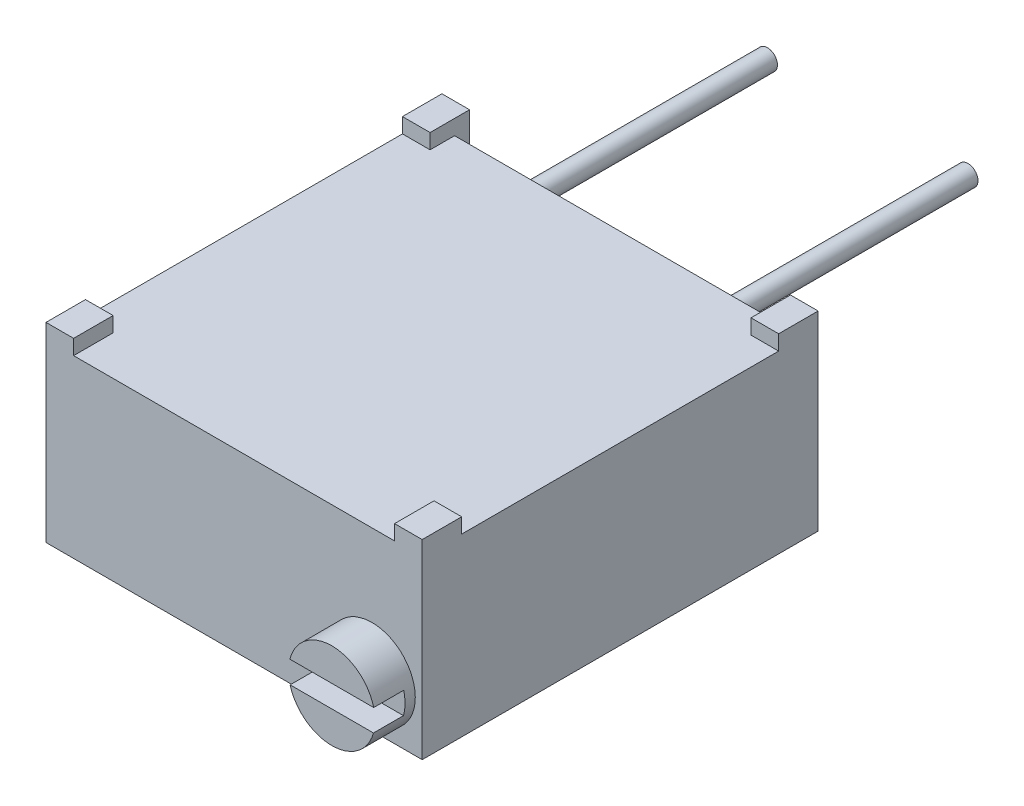
ISO-10303-21;
HEADER;
FILE_DESCRIPTION(('STEP AP214'),'2;1');
FILE_NAME('part.step','',(''),(''),'','','');
FILE_SCHEMA(('AUTOMOTIVE_DESIGN { 1 0 10303 214 1 1 1 1 }'));
ENDSEC;
DATA;
#1=APPLICATION_CONTEXT('core data for automotive mechanical design processes');
#2=APPLICATION_PROTOCOL_DEFINITION('international standard','automotive_design',2000,#1);
#3=PRODUCT_CONTEXT('',#1,'mechanical');
#4=PRODUCT('Part','Part','',(#3));
#5=PRODUCT_RELATED_PRODUCT_CATEGORY('part','',(#4));
#6=PRODUCT_DEFINITION_FORMATION('','',#4);
#7=PRODUCT_DEFINITION_CONTEXT('part definition',#1,'design');
#8=PRODUCT_DEFINITION('design','',#6,#7);
#9=PRODUCT_DEFINITION_SHAPE('','',#8);
#10=(LENGTH_UNIT() NAMED_UNIT(*) SI_UNIT(.MILLI.,.METRE.));
#11=(NAMED_UNIT(*) PLANE_ANGLE_UNIT() SI_UNIT($,.RADIAN.));
#12=(NAMED_UNIT(*) SI_UNIT($,.STERADIAN.) SOLID_ANGLE_UNIT());
#13=UNCERTAINTY_MEASURE_WITH_UNIT(LENGTH_MEASURE(1.E-05),#10,'distance_accuracy_value','');
#14=(GEOMETRIC_REPRESENTATION_CONTEXT(3) GLOBAL_UNCERTAINTY_ASSIGNED_CONTEXT((#13)) GLOBAL_UNIT_ASSIGNED_CONTEXT((#10,
#11,#12)) REPRESENTATION_CONTEXT('',''));
#15=CARTESIAN_POINT('',(0.,0.,0.));
#16=DIRECTION('',(0.,0.,1.));
#17=DIRECTION('',(1.,0.,0.));
#18=AXIS2_PLACEMENT_3D('',#15,#16,#17);
#19=CARTESIAN_POINT('',(0.,0.,-6.02));
#20=DIRECTION('',(0.,0.,1.));
#21=DIRECTION('',(1.,0.,0.));
#22=AXIS2_PLACEMENT_3D('',#19,#20,#21);
#23=PLANE('',#22);
#24=CARTESIAN_POINT('',(0.,0.,-6.02));
#25=DIRECTION('',(0.,0.,1.));
#26=DIRECTION('',(1.,0.,0.));
#27=AXIS2_PLACEMENT_3D('',#24,#25,#26);
#28=CIRCLE('',#27,0.255);
#29=CARTESIAN_POINT('',(0.255,0.,-6.02));
#30=VERTEX_POINT('',#29);
#31=EDGE_CURVE('E41',#30,#30,#28,.T.);
#32=ORIENTED_EDGE('',*,*,#31,.F.);
#33=EDGE_LOOP('',(#32));
#34=FACE_BOUND('',#33,.T.);
#35=ADVANCED_FACE('F16',(#34),#23,.F.);
#36=CARTESIAN_POINT('',(-2.54,-2.54,-6.02));
#37=DIRECTION('',(0.,0.,1.));
#38=DIRECTION('',(1.,0.,0.));
#39=AXIS2_PLACEMENT_3D('',#36,#37,#38);
#40=PLANE('',#39);
#41=CARTESIAN_POINT('',(-2.54,-2.54,-6.02));
#42=DIRECTION('',(0.,0.,1.));
#43=DIRECTION('',(1.,0.,0.));
#44=AXIS2_PLACEMENT_3D('',#41,#42,#43);
#45=CIRCLE('',#44,0.255);
#46=CARTESIAN_POINT('',(-2.285,-2.54,-6.02));
#47=VERTEX_POINT('',#46);
#48=EDGE_CURVE('E260',#47,#47,#45,.T.);
#49=ORIENTED_EDGE('',*,*,#48,.F.);
#50=EDGE_LOOP('',(#49));
#51=FACE_BOUND('',#50,.T.);
#52=ADVANCED_FACE('F661',(#51),#40,.F.);
#53=CARTESIAN_POINT('',(-5.08,0.,-6.02));
#54=DIRECTION('',(0.,0.,1.));
#55=DIRECTION('',(1.,0.,0.));
#56=AXIS2_PLACEMENT_3D('',#53,#54,#55);
#57=PLANE('',#56);
#58=CARTESIAN_POINT('',(-5.08,0.,-6.02));
#59=DIRECTION('',(0.,0.,1.));
#60=DIRECTION('',(1.,0.,0.));
#61=AXIS2_PLACEMENT_3D('',#58,#59,#60);
#62=CIRCLE('',#61,0.255);
#63=CARTESIAN_POINT('',(-4.825,0.,-6.02));
#64=VERTEX_POINT('',#63);
#65=EDGE_CURVE('E247',#64,#64,#62,.T.);
#66=ORIENTED_EDGE('',*,*,#65,.F.);
#67=EDGE_LOOP('',(#66));
#68=FACE_BOUND('',#67,.T.);
#69=ADVANCED_FACE('F674',(#68),#57,.F.);
#70=CARTESIAN_POINT('',(0.955,-2.41,11.05));
#71=DIRECTION('',(0.,0.,1.));
#72=DIRECTION('',(1.,0.,0.));
#73=AXIS2_PLACEMENT_3D('',#70,#71,#72);
#74=PLANE('',#73);
#75=CARTESIAN_POINT('',(0.955,-2.41,11.05));
#76=DIRECTION('',(0.,0.,1.));
#77=DIRECTION('',(1.,0.,0.));
#78=AXIS2_PLACEMENT_3D('',#75,#76,#77);
#79=CIRCLE('',#78,1.095);
#80=CARTESIAN_POINT('',(-0.100900089971,-2.7,11.05));
#81=VERTEX_POINT('',#80);
#82=CARTESIAN_POINT('',(2.010900089971,-2.7,11.05));
#83=VERTEX_POINT('',#82);
#84=EDGE_CURVE('E300',#81,#83,#79,.T.);
#85=ORIENTED_EDGE('',*,*,#84,.T.);
#86=DIRECTION('',(1.,0.,0.));
#87=VECTOR('',#86,1.);
#88=CARTESIAN_POINT('',(-3.64,-2.7,11.05));
#89=LINE('',#88,#87);
#90=EDGE_CURVE('E11',#81,#83,#89,.T.);
#91=ORIENTED_EDGE('',*,*,#90,.F.);
#92=EDGE_LOOP('',(#85,#91));
#93=FACE_BOUND('',#92,.T.);
#94=ADVANCED_FACE('F469',(#93),#74,.T.);
#95=CARTESIAN_POINT('',(-3.64,-2.7,10.29));
#96=DIRECTION('',(0.,1.,0.));
#97=DIRECTION('',(1.,0.,0.));
#98=AXIS2_PLACEMENT_3D('',#95,#96,#97);
#99=PLANE('',#98);
#100=DIRECTION('',(1.,0.,0.));
#101=VECTOR('',#100,1.);
#102=CARTESIAN_POINT('',(-3.64,-2.7,10.29));
#103=LINE('',#102,#101);
#104=CARTESIAN_POINT('',(-0.100900089971,-2.7,10.29));
#105=VERTEX_POINT('',#104);
#106=CARTESIAN_POINT('',(2.010900089971,-2.7,10.29));
#107=VERTEX_POINT('',#106);
#108=EDGE_CURVE('E27',#105,#107,#103,.T.);
#109=ORIENTED_EDGE('',*,*,#108,.F.);
#110=DIRECTION('',(0.,0.,1.));
#111=VECTOR('',#110,1.);
#112=CARTESIAN_POINT('',(-0.100900089971,-2.7,10.03));
#113=LINE('',#112,#111);
#114=EDGE_CURVE('E377',#105,#81,#113,.T.);
#115=ORIENTED_EDGE('',*,*,#114,.T.);
#116=ORIENTED_EDGE('',*,*,#90,.T.);
#117=DIRECTION('',(0.,0.,1.));
#118=VECTOR('',#117,1.);
#119=CARTESIAN_POINT('',(2.010900089971,-2.7,10.03));
#120=LINE('',#119,#118);
#121=EDGE_CURVE('E296',#107,#83,#120,.T.);
#122=ORIENTED_EDGE('',*,*,#121,.F.);
#123=EDGE_LOOP('',(#109,#115,#116,#122));
#124=FACE_BOUND('',#123,.T.);
#125=ADVANCED_FACE('F475',(#124),#99,.T.);
#126=CARTESIAN_POINT('',(-3.64,-2.7,10.29));
#127=DIRECTION('',(0.,0.,1.));
#128=DIRECTION('',(1.,0.,0.));
#129=AXIS2_PLACEMENT_3D('',#126,#127,#128);
#130=PLANE('',#129);
#131=DIRECTION('',(1.,0.,0.));
#132=VECTOR('',#131,1.);
#133=CARTESIAN_POINT('',(-3.64,-2.14,10.29));
#134=LINE('',#133,#132);
#135=CARTESIAN_POINT('',(-0.106190369349,-2.14,10.29));
#136=VERTEX_POINT('',#135);
#137=CARTESIAN_POINT('',(2.016190369349,-2.14,10.29));
#138=VERTEX_POINT('',#137);
#139=EDGE_CURVE('E478',#136,#138,#134,.T.);
#140=ORIENTED_EDGE('',*,*,#139,.F.);
#141=CARTESIAN_POINT('',(0.955,-2.41,10.29));
#142=DIRECTION('',(0.,0.,1.));
#143=DIRECTION('',(1.,0.,0.));
#144=AXIS2_PLACEMENT_3D('',#141,#142,#143);
#145=CIRCLE('',#144,1.095);
#146=EDGE_CURVE('E373',#136,#105,#145,.T.);
#147=ORIENTED_EDGE('',*,*,#146,.T.);
#148=ORIENTED_EDGE('',*,*,#108,.T.);
#149=CARTESIAN_POINT('',(0.955,-2.41,10.29));
#150=DIRECTION('',(0.,0.,1.));
#151=DIRECTION('',(1.,0.,0.));
#152=AXIS2_PLACEMENT_3D('',#149,#150,#151);
#153=CIRCLE('',#152,1.095);
#154=CARTESIAN_POINT('',(2.05,-2.41,10.29));
#155=VERTEX_POINT('',#154);
#156=EDGE_CURVE('E167',#107,#155,#153,.T.);
#157=ORIENTED_EDGE('',*,*,#156,.T.);
#158=CARTESIAN_POINT('',(0.955,-2.41,10.29));
#159=DIRECTION('',(0.,0.,1.));
#160=DIRECTION('',(1.,0.,0.));
#161=AXIS2_PLACEMENT_3D('',#158,#159,#160);
#162=CIRCLE('',#161,1.095);
#163=EDGE_CURVE('E304',#155,#138,#162,.T.);
#164=ORIENTED_EDGE('',*,*,#163,.T.);
#165=EDGE_LOOP('',(#140,#147,#148,#157,#164));
#166=FACE_BOUND('',#165,.T.);
#167=ADVANCED_FACE('F18',(#166),#130,.T.);
#168=CARTESIAN_POINT('',(-3.64,-2.14,10.29));
#169=DIRECTION('',(0.,1.,0.));
#170=DIRECTION('',(1.,0.,0.));
#171=AXIS2_PLACEMENT_3D('',#168,#169,#170);
#172=PLANE('',#171);
#173=DIRECTION('',(0.,0.,1.));
#174=VECTOR('',#173,1.);
#175=CARTESIAN_POINT('',(2.016190369349,-2.14,10.03));
#176=LINE('',#175,#174);
#177=CARTESIAN_POINT('',(2.016190369349,-2.14,11.05));
#178=VERTEX_POINT('',#177);
#179=EDGE_CURVE('E301',#138,#178,#176,.T.);
#180=ORIENTED_EDGE('',*,*,#179,.T.);
#181=DIRECTION('',(1.,0.,0.));
#182=VECTOR('',#181,1.);
#183=CARTESIAN_POINT('',(-3.64,-2.14,11.05));
#184=LINE('',#183,#182);
#185=CARTESIAN_POINT('',(-0.106190369349,-2.14,11.05));
#186=VERTEX_POINT('',#185);
#187=EDGE_CURVE('E483',#186,#178,#184,.T.);
#188=ORIENTED_EDGE('',*,*,#187,.F.);
#189=DIRECTION('',(0.,0.,1.));
#190=VECTOR('',#189,1.);
#191=CARTESIAN_POINT('',(-0.106190369349,-2.14,10.03));
#192=LINE('',#191,#190);
#193=EDGE_CURVE('E376',#136,#186,#192,.T.);
#194=ORIENTED_EDGE('',*,*,#193,.F.);
#195=ORIENTED_EDGE('',*,*,#139,.T.);
#196=EDGE_LOOP('',(#180,#188,#194,#195));
#197=FACE_BOUND('',#196,.T.);
#198=ADVANCED_FACE('F485',(#197),#172,.F.);
#199=CARTESIAN_POINT('',(0.955,-2.41,11.05));
#200=DIRECTION('',(0.,0.,1.));
#201=DIRECTION('',(1.,0.,0.));
#202=AXIS2_PLACEMENT_3D('',#199,#200,#201);
#203=PLANE('',#202);
#204=ORIENTED_EDGE('',*,*,#187,.T.);
#205=CARTESIAN_POINT('',(0.955,-2.41,11.05));
#206=DIRECTION('',(0.,0.,1.));
#207=DIRECTION('',(1.,0.,0.));
#208=AXIS2_PLACEMENT_3D('',#205,#206,#207);
#209=CIRCLE('',#208,1.095);
#210=EDGE_CURVE('E305',#178,#186,#209,.T.);
#211=ORIENTED_EDGE('',*,*,#210,.T.);
#212=EDGE_LOOP('',(#204,#211));
#213=FACE_BOUND('',#212,.T.);
#214=ADVANCED_FACE('F720',(#213),#203,.T.);
#215=CARTESIAN_POINT('',(-7.305,1.14,1.));
#216=DIRECTION('',(0.,-1.,0.));
#217=DIRECTION('',(0.,0.,-1.));
#218=AXIS2_PLACEMENT_3D('',#215,#216,#217);
#219=PLANE('',#218);
#220=DIRECTION('',(0.,0.,-1.));
#221=VECTOR('',#220,1.);
#222=CARTESIAN_POINT('',(-6.605,1.14,1.));
#223=LINE('',#222,#221);
#224=CARTESIAN_POINT('',(-6.605,1.14,1.));
#225=VERTEX_POINT('',#224);
#226=CARTESIAN_POINT('',(-6.605,1.14,0.));
#227=VERTEX_POINT('',#226);
#228=EDGE_CURVE('E309',#225,#227,#223,.T.);
#229=ORIENTED_EDGE('',*,*,#228,.T.);
#230=DIRECTION('',(1.,0.,0.));
#231=VECTOR('',#230,1.);
#232=CARTESIAN_POINT('',(-7.305,1.14,0.));
#233=LINE('',#232,#231);
#234=CARTESIAN_POINT('',(-7.305,1.14,0.));
#235=VERTEX_POINT('',#234);
#236=EDGE_CURVE('E488',#235,#227,#233,.T.);
#237=ORIENTED_EDGE('',*,*,#236,.F.);
#238=DIRECTION('',(0.,0.,-1.));
#239=VECTOR('',#238,1.);
#240=CARTESIAN_POINT('',(-7.305,1.14,1.));
#241=LINE('',#240,#239);
#242=CARTESIAN_POINT('',(-7.305,1.14,1.));
#243=VERTEX_POINT('',#242);
#244=EDGE_CURVE('E441',#243,#235,#241,.T.);
#245=ORIENTED_EDGE('',*,*,#244,.F.);
#246=DIRECTION('',(1.,0.,0.));
#247=VECTOR('',#246,1.);
#248=CARTESIAN_POINT('',(-7.305,1.14,1.));
#249=LINE('',#248,#247);
#250=EDGE_CURVE('E433',#243,#225,#249,.T.);
#251=ORIENTED_EDGE('',*,*,#250,.T.);
#252=EDGE_LOOP('',(#229,#237,#245,#251));
#253=FACE_BOUND('',#252,.T.);
#254=ADVANCED_FACE('F621',(#253),#219,.F.);
#255=CARTESIAN_POINT('',(-7.305,1.14,0.));
#256=DIRECTION('',(0.,0.,-1.));
#257=DIRECTION('',(0.,-1.,0.));
#258=AXIS2_PLACEMENT_3D('',#255,#256,#257);
#259=PLANE('',#258);
#260=DIRECTION('',(0.,-1.,0.));
#261=VECTOR('',#260,1.);
#262=CARTESIAN_POINT('',(-7.305,1.14,0.));
#263=LINE('',#262,#261);
#264=CARTESIAN_POINT('',(-7.305,-3.69,0.));
#265=VERTEX_POINT('',#264);
#266=EDGE_CURVE('E396',#235,#265,#263,.T.);
#267=ORIENTED_EDGE('',*,*,#266,.F.);
#268=ORIENTED_EDGE('',*,*,#236,.T.);
#269=DIRECTION('',(0.,-1.,0.));
#270=VECTOR('',#269,1.);
#271=CARTESIAN_POINT('',(-6.605,1.14,0.));
#272=LINE('',#271,#270);
#273=CARTESIAN_POINT('',(-6.605,-3.69,0.));
#274=VERTEX_POINT('',#273);
#275=EDGE_CURVE('E306',#227,#274,#272,.T.);
#276=ORIENTED_EDGE('',*,*,#275,.T.);
#277=DIRECTION('',(1.,0.,0.));
#278=VECTOR('',#277,1.);
#279=CARTESIAN_POINT('',(-7.305,-3.69,0.));
#280=LINE('',#279,#278);
#281=EDGE_CURVE('E354',#265,#274,#280,.T.);
#282=ORIENTED_EDGE('',*,*,#281,.F.);
#283=EDGE_LOOP('',(#267,#268,#276,#282));
#284=FACE_BOUND('',#283,.T.);
#285=ADVANCED_FACE('F617',(#284),#259,.T.);
#286=CARTESIAN_POINT('',(0.,0.,-6.02));
#287=DIRECTION('',(0.,0.,1.));
#288=DIRECTION('',(1.,0.,0.));
#289=AXIS2_PLACEMENT_3D('',#286,#287,#288);
#290=CYLINDRICAL_SURFACE('',#289,0.255);
#291=CARTESIAN_POINT('',(0.,0.,0.38));
#292=DIRECTION('',(0.,0.,1.));
#293=DIRECTION('',(1.,0.,0.));
#294=AXIS2_PLACEMENT_3D('',#291,#292,#293);
#295=CIRCLE('',#294,0.255);
#296=CARTESIAN_POINT('',(0.255,0.,0.38));
#297=VERTEX_POINT('',#296);
#298=EDGE_CURVE('E310',#297,#297,#295,.T.);
#299=ORIENTED_EDGE('',*,*,#298,.F.);
#300=DIRECTION('',(0.,0.,1.));
#301=VECTOR('',#300,1.);
#302=CARTESIAN_POINT('',(0.255,0.,-6.02));
#303=LINE('',#302,#301);
#304=EDGE_CURVE('E293',#30,#297,#303,.T.);
#305=ORIENTED_EDGE('',*,*,#304,.F.);
#306=ORIENTED_EDGE('',*,*,#31,.T.);
#307=ORIENTED_EDGE('',*,*,#304,.T.);
#308=EDGE_LOOP('',(#299,#305,#306,#307));
#309=FACE_BOUND('',#308,.T.);
#310=ADVANCED_FACE('F737',(#309),#290,.T.);
#311=CARTESIAN_POINT('',(-2.54,-2.54,-6.02));
#312=DIRECTION('',(0.,0.,1.));
#313=DIRECTION('',(1.,0.,0.));
#314=AXIS2_PLACEMENT_3D('',#311,#312,#313);
#315=CYLINDRICAL_SURFACE('',#314,0.255);
#316=CARTESIAN_POINT('',(-2.54,-2.54,0.38));
#317=DIRECTION('',(0.,0.,1.));
#318=DIRECTION('',(1.,0.,0.));
#319=AXIS2_PLACEMENT_3D('',#316,#317,#318);
#320=CIRCLE('',#319,0.255);
#321=CARTESIAN_POINT('',(-2.285,-2.54,0.38));
#322=VERTEX_POINT('',#321);
#323=EDGE_CURVE('E323',#322,#322,#320,.T.);
#324=ORIENTED_EDGE('',*,*,#323,.F.);
#325=DIRECTION('',(0.,0.,1.));
#326=VECTOR('',#325,1.);
#327=CARTESIAN_POINT('',(-2.285,-2.54,-6.02));
#328=LINE('',#327,#326);
#329=EDGE_CURVE('E254',#47,#322,#328,.T.);
#330=ORIENTED_EDGE('',*,*,#329,.F.);
#331=ORIENTED_EDGE('',*,*,#48,.T.);
#332=ORIENTED_EDGE('',*,*,#329,.T.);
#333=EDGE_LOOP('',(#324,#330,#331,#332));
#334=FACE_BOUND('',#333,.T.);
#335=ADVANCED_FACE('F742',(#334),#315,.T.);
#336=CARTESIAN_POINT('',(-5.08,0.,-6.02));
#337=DIRECTION('',(0.,0.,1.));
#338=DIRECTION('',(1.,0.,0.));
#339=AXIS2_PLACEMENT_3D('',#336,#337,#338);
#340=CYLINDRICAL_SURFACE('',#339,0.255);
#341=CARTESIAN_POINT('',(-5.08,0.,0.38));
#342=DIRECTION('',(0.,0.,1.));
#343=DIRECTION('',(1.,0.,0.));
#344=AXIS2_PLACEMENT_3D('',#341,#342,#343);
#345=CIRCLE('',#344,0.255);
#346=CARTESIAN_POINT('',(-4.825,0.,0.38));
#347=VERTEX_POINT('',#346);
#348=EDGE_CURVE('E332',#347,#347,#345,.T.);
#349=ORIENTED_EDGE('',*,*,#348,.F.);
#350=DIRECTION('',(0.,0.,1.));
#351=VECTOR('',#350,1.);
#352=CARTESIAN_POINT('',(-4.825,0.,-6.02));
#353=LINE('',#352,#351);
#354=EDGE_CURVE('E250',#64,#347,#353,.T.);
#355=ORIENTED_EDGE('',*,*,#354,.F.);
#356=ORIENTED_EDGE('',*,*,#65,.T.);
#357=ORIENTED_EDGE('',*,*,#354,.T.);
#358=EDGE_LOOP('',(#349,#355,#356,#357));
#359=FACE_BOUND('',#358,.T.);
#360=ADVANCED_FACE('F249',(#359),#340,.T.);
#361=CARTESIAN_POINT('',(1.525,1.14,1.));
#362=DIRECTION('',(0.,-1.,0.));
#363=DIRECTION('',(0.,0.,-1.));
#364=AXIS2_PLACEMENT_3D('',#361,#362,#363);
#365=PLANE('',#364);
#366=DIRECTION('',(0.,0.,-1.));
#367=VECTOR('',#366,1.);
#368=CARTESIAN_POINT('',(2.225,1.14,1.));
#369=LINE('',#368,#367);
#370=CARTESIAN_POINT('',(2.225,1.14,1.));
#371=VERTEX_POINT('',#370);
#372=CARTESIAN_POINT('',(2.225,1.14,0.));
#373=VERTEX_POINT('',#372);
#374=EDGE_CURVE('E281',#371,#373,#369,.T.);
#375=ORIENTED_EDGE('',*,*,#374,.T.);
#376=DIRECTION('',(1.,0.,0.));
#377=VECTOR('',#376,1.);
#378=CARTESIAN_POINT('',(1.525,1.14,0.));
#379=LINE('',#378,#377);
#380=CARTESIAN_POINT('',(1.525,1.14,0.));
#381=VERTEX_POINT('',#380);
#382=EDGE_CURVE('E103',#381,#373,#379,.T.);
#383=ORIENTED_EDGE('',*,*,#382,.F.);
#384=DIRECTION('',(0.,0.,-1.));
#385=VECTOR('',#384,1.);
#386=CARTESIAN_POINT('',(1.525,1.14,1.));
#387=LINE('',#386,#385);
#388=CARTESIAN_POINT('',(1.525,1.14,1.));
#389=VERTEX_POINT('',#388);
#390=EDGE_CURVE('E381',#389,#381,#387,.T.);
#391=ORIENTED_EDGE('',*,*,#390,.F.);
#392=DIRECTION('',(1.,0.,0.));
#393=VECTOR('',#392,1.);
#394=CARTESIAN_POINT('',(1.525,1.14,1.));
#395=LINE('',#394,#393);
#396=EDGE_CURVE('E424',#389,#371,#395,.T.);
#397=ORIENTED_EDGE('',*,*,#396,.T.);
#398=EDGE_LOOP('',(#375,#383,#391,#397));
#399=FACE_BOUND('',#398,.T.);
#400=ADVANCED_FACE('F558',(#399),#365,.F.);
#401=CARTESIAN_POINT('',(1.525,1.14,0.));
#402=DIRECTION('',(0.,0.,-1.));
#403=DIRECTION('',(0.,-1.,0.));
#404=AXIS2_PLACEMENT_3D('',#401,#402,#403);
#405=PLANE('',#404);
#406=DIRECTION('',(0.,-1.,0.));
#407=VECTOR('',#406,1.);
#408=CARTESIAN_POINT('',(1.525,1.14,0.));
#409=LINE('',#408,#407);
#410=CARTESIAN_POINT('',(1.525,-3.69,0.));
#411=VERTEX_POINT('',#410);
#412=EDGE_CURVE('E336',#381,#411,#409,.T.);
#413=ORIENTED_EDGE('',*,*,#412,.F.);
#414=ORIENTED_EDGE('',*,*,#382,.T.);
#415=DIRECTION('',(0.,-1.,0.));
#416=VECTOR('',#415,1.);
#417=CARTESIAN_POINT('',(2.225,1.14,0.));
#418=LINE('',#417,#416);
#419=CARTESIAN_POINT('',(2.225,-3.69,0.));
#420=VERTEX_POINT('',#419);
#421=EDGE_CURVE('E277',#373,#420,#418,.T.);
#422=ORIENTED_EDGE('',*,*,#421,.T.);
#423=DIRECTION('',(1.,0.,0.));
#424=VECTOR('',#423,1.);
#425=CARTESIAN_POINT('',(1.525,-3.69,0.));
#426=LINE('',#425,#424);
#427=EDGE_CURVE('E356',#411,#420,#426,.T.);
#428=ORIENTED_EDGE('',*,*,#427,.F.);
#429=EDGE_LOOP('',(#413,#414,#422,#428));
#430=FACE_BOUND('',#429,.T.);
#431=ADVANCED_FACE('F555',(#430),#405,.T.);
#432=CARTESIAN_POINT('',(0.955,-2.41,10.03));
#433=DIRECTION('',(0.,0.,1.));
#434=DIRECTION('',(1.,0.,0.));
#435=AXIS2_PLACEMENT_3D('',#432,#433,#434);
#436=CYLINDRICAL_SURFACE('',#435,1.095);
#437=ORIENTED_EDGE('',*,*,#210,.F.);
#438=ORIENTED_EDGE('',*,*,#179,.F.);
#439=ORIENTED_EDGE('',*,*,#163,.F.);
#440=DIRECTION('',(0.,0.,1.));
#441=VECTOR('',#440,1.);
#442=CARTESIAN_POINT('',(2.05,-2.41,10.03));
#443=LINE('',#442,#441);
#444=CARTESIAN_POINT('',(2.05,-2.41,10.03));
#445=VERTEX_POINT('',#444);
#446=EDGE_CURVE('E459',#445,#155,#443,.T.);
#447=ORIENTED_EDGE('',*,*,#446,.F.);
#448=CARTESIAN_POINT('',(0.955,-2.41,10.03));
#449=DIRECTION('',(0.,0.,1.));
#450=DIRECTION('',(1.,0.,0.));
#451=AXIS2_PLACEMENT_3D('',#448,#449,#450);
#452=CIRCLE('',#451,1.095);
#453=EDGE_CURVE('E292',#445,#445,#452,.T.);
#454=ORIENTED_EDGE('',*,*,#453,.T.);
#455=ORIENTED_EDGE('',*,*,#446,.T.);
#456=ORIENTED_EDGE('',*,*,#156,.F.);
#457=ORIENTED_EDGE('',*,*,#121,.T.);
#458=ORIENTED_EDGE('',*,*,#84,.F.);
#459=ORIENTED_EDGE('',*,*,#114,.F.);
#460=ORIENTED_EDGE('',*,*,#146,.F.);
#461=ORIENTED_EDGE('',*,*,#193,.T.);
#462=EDGE_LOOP('',(#437,#438,#439,#447,#454,#455,#456,#457,#458,#459,#460,#461));
#463=FACE_BOUND('',#462,.T.);
#464=ADVANCED_FACE('F473',(#463),#436,.T.);
#465=CARTESIAN_POINT('',(1.525,1.14,10.03));
#466=DIRECTION('',(0.,-1.,0.));
#467=DIRECTION('',(0.,0.,-1.));
#468=AXIS2_PLACEMENT_3D('',#465,#466,#467);
#469=PLANE('',#468);
#470=DIRECTION('',(0.,0.,-1.));
#471=VECTOR('',#470,1.);
#472=CARTESIAN_POINT('',(2.225,1.14,10.03));
#473=LINE('',#472,#471);
#474=CARTESIAN_POINT('',(2.225,1.14,10.03));
#475=VERTEX_POINT('',#474);
#476=CARTESIAN_POINT('',(2.225,1.14,9.03));
#477=VERTEX_POINT('',#476);
#478=EDGE_CURVE('E452',#475,#477,#473,.T.);
#479=ORIENTED_EDGE('',*,*,#478,.T.);
#480=DIRECTION('',(1.,0.,0.));
#481=VECTOR('',#480,1.);
#482=CARTESIAN_POINT('',(1.525,1.14,9.03));
#483=LINE('',#482,#481);
#484=CARTESIAN_POINT('',(1.525,1.14,9.03));
#485=VERTEX_POINT('',#484);
#486=EDGE_CURVE('E266',#485,#477,#483,.T.);
#487=ORIENTED_EDGE('',*,*,#486,.F.);
#488=DIRECTION('',(0.,0.,-1.));
#489=VECTOR('',#488,1.);
#490=CARTESIAN_POINT('',(1.525,1.14,10.03));
#491=LINE('',#490,#489);
#492=CARTESIAN_POINT('',(1.525,1.14,10.03));
#493=VERTEX_POINT('',#492);
#494=EDGE_CURVE('E276',#493,#485,#491,.T.);
#495=ORIENTED_EDGE('',*,*,#494,.F.);
#496=DIRECTION('',(1.,0.,0.));
#497=VECTOR('',#496,1.);
#498=CARTESIAN_POINT('',(1.525,1.14,10.03));
#499=LINE('',#498,#497);
#500=EDGE_CURVE('E402',#493,#475,#499,.T.);
#501=ORIENTED_EDGE('',*,*,#500,.T.);
#502=EDGE_LOOP('',(#479,#487,#495,#501));
#503=FACE_BOUND('',#502,.T.);
#504=ADVANCED_FACE('F526',(#503),#469,.F.);
#505=CARTESIAN_POINT('',(-7.305,1.14,10.03));
#506=DIRECTION('',(0.,-1.,0.));
#507=DIRECTION('',(0.,0.,-1.));
#508=AXIS2_PLACEMENT_3D('',#505,#506,#507);
#509=PLANE('',#508);
#510=DIRECTION('',(0.,0.,-1.));
#511=VECTOR('',#510,1.);
#512=CARTESIAN_POINT('',(-6.605,1.14,10.03));
#513=LINE('',#512,#511);
#514=CARTESIAN_POINT('',(-6.605,1.14,10.03));
#515=VERTEX_POINT('',#514);
#516=CARTESIAN_POINT('',(-6.605,1.14,9.03));
#517=VERTEX_POINT('',#516);
#518=EDGE_CURVE('E353',#515,#517,#513,.T.);
#519=ORIENTED_EDGE('',*,*,#518,.T.);
#520=DIRECTION('',(1.,0.,0.));
#521=VECTOR('',#520,1.);
#522=CARTESIAN_POINT('',(-7.305,1.14,9.03));
#523=LINE('',#522,#521);
#524=CARTESIAN_POINT('',(-7.305,1.14,9.03));
#525=VERTEX_POINT('',#524);
#526=EDGE_CURVE('E20',#525,#517,#523,.T.);
#527=ORIENTED_EDGE('',*,*,#526,.F.);
#528=DIRECTION('',(0.,0.,-1.));
#529=VECTOR('',#528,1.);
#530=CARTESIAN_POINT('',(-7.305,1.14,10.03));
#531=LINE('',#530,#529);
#532=CARTESIAN_POINT('',(-7.305,1.14,10.03));
#533=VERTEX_POINT('',#532);
#534=EDGE_CURVE('E442',#533,#525,#531,.T.);
#535=ORIENTED_EDGE('',*,*,#534,.F.);
#536=DIRECTION('',(1.,0.,0.));
#537=VECTOR('',#536,1.);
#538=CARTESIAN_POINT('',(-7.305,1.14,10.03));
#539=LINE('',#538,#537);
#540=EDGE_CURVE('E347',#533,#515,#539,.T.);
#541=ORIENTED_EDGE('',*,*,#540,.T.);
#542=EDGE_LOOP('',(#519,#527,#535,#541));
#543=FACE_BOUND('',#542,.T.);
#544=ADVANCED_FACE('F610',(#543),#509,.F.);
#545=CARTESIAN_POINT('',(-2.54,-3.69,5.000516549649));
#546=DIRECTION('',(0.,-1.,0.));
#547=DIRECTION('',(0.,0.,-1.));
#548=AXIS2_PLACEMENT_3D('',#545,#546,#547);
#549=PLANE('',#548);
#550=DIRECTION('',(1.,0.,0.));
#551=VECTOR('',#550,1.);
#552=CARTESIAN_POINT('',(-7.305,-3.69,10.03));
#553=LINE('',#552,#551);
#554=CARTESIAN_POINT('',(-7.305,-3.69,10.03));
#555=VERTEX_POINT('',#554);
#556=CARTESIAN_POINT('',(2.225,-3.69,10.03));
#557=VERTEX_POINT('',#556);
#558=EDGE_CURVE('E362',#555,#557,#553,.T.);
#559=ORIENTED_EDGE('',*,*,#558,.F.);
#560=DIRECTION('',(0.,0.,-1.));
#561=VECTOR('',#560,1.);
#562=CARTESIAN_POINT('',(-7.305,-3.69,1.));
#563=LINE('',#562,#561);
#564=EDGE_CURVE('E392',#555,#265,#563,.T.);
#565=ORIENTED_EDGE('',*,*,#564,.T.);
#566=ORIENTED_EDGE('',*,*,#281,.T.);
#567=DIRECTION('',(0.,0.,-1.));
#568=VECTOR('',#567,1.);
#569=CARTESIAN_POINT('',(-6.605,-3.69,1.));
#570=LINE('',#569,#568);
#571=CARTESIAN_POINT('',(-6.605,-3.69,0.38));
#572=VERTEX_POINT('',#571);
#573=EDGE_CURVE('E86',#572,#274,#570,.T.);
#574=ORIENTED_EDGE('',*,*,#573,.F.);
#575=DIRECTION('',(1.,0.,0.));
#576=VECTOR('',#575,1.);
#577=CARTESIAN_POINT('',(-7.305,-3.69,0.38));
#578=LINE('',#577,#576);
#579=CARTESIAN_POINT('',(1.525,-3.69,0.38));
#580=VERTEX_POINT('',#579);
#581=EDGE_CURVE('E517',#572,#580,#578,.T.);
#582=ORIENTED_EDGE('',*,*,#581,.T.);
#583=DIRECTION('',(0.,0.,-1.));
#584=VECTOR('',#583,1.);
#585=CARTESIAN_POINT('',(1.525,-3.69,1.));
#586=LINE('',#585,#584);
#587=EDGE_CURVE('E364',#580,#411,#586,.T.);
#588=ORIENTED_EDGE('',*,*,#587,.T.);
#589=ORIENTED_EDGE('',*,*,#427,.T.);
#590=DIRECTION('',(0.,0.,-1.));
#591=VECTOR('',#590,1.);
#592=CARTESIAN_POINT('',(2.225,-3.69,1.));
#593=LINE('',#592,#591);
#594=EDGE_CURVE('E282',#557,#420,#593,.T.);
#595=ORIENTED_EDGE('',*,*,#594,.F.);
#596=EDGE_LOOP('',(#559,#565,#566,#574,#582,#588,#589,#595));
#597=FACE_BOUND('',#596,.T.);
#598=ADVANCED_FACE('F551',(#597),#549,.T.);
#599=CARTESIAN_POINT('',(-6.605,1.14,10.03));
#600=DIRECTION('',(1.,0.,0.));
#601=DIRECTION('',(0.,1.,0.));
#602=AXIS2_PLACEMENT_3D('',#599,#600,#601);
#603=PLANE('',#602);
#604=DIRECTION('',(0.,-1.,0.));
#605=VECTOR('',#604,1.);
#606=CARTESIAN_POINT('',(-6.605,1.14,9.03));
#607=LINE('',#606,#605);
#608=CARTESIAN_POINT('',(-6.605,0.76,9.03));
#609=VERTEX_POINT('',#608);
#610=EDGE_CURVE('E350',#517,#609,#607,.T.);
#611=ORIENTED_EDGE('',*,*,#610,.F.);
#612=ORIENTED_EDGE('',*,*,#518,.F.);
#613=DIRECTION('',(0.,-1.,0.));
#614=VECTOR('',#613,1.);
#615=CARTESIAN_POINT('',(-6.605,1.14,10.03));
#616=LINE('',#615,#614);
#617=CARTESIAN_POINT('',(-6.605,0.76,10.03));
#618=VERTEX_POINT('',#617);
#619=EDGE_CURVE('E345',#515,#618,#616,.T.);
#620=ORIENTED_EDGE('',*,*,#619,.T.);
#621=DIRECTION('',(0.,0.,1.));
#622=VECTOR('',#621,1.);
#623=CARTESIAN_POINT('',(-6.605,0.76,10.03));
#624=LINE('',#623,#622);
#625=EDGE_CURVE('E363',#609,#618,#624,.T.);
#626=ORIENTED_EDGE('',*,*,#625,.F.);
#627=EDGE_LOOP('',(#611,#612,#620,#626));
#628=FACE_BOUND('',#627,.T.);
#629=ADVANCED_FACE('F607',(#628),#603,.T.);
#630=CARTESIAN_POINT('',(-7.305,1.14,9.03));
#631=DIRECTION('',(0.,0.,-1.));
#632=DIRECTION('',(0.,-1.,0.));
#633=AXIS2_PLACEMENT_3D('',#630,#631,#632);
#634=PLANE('',#633);
#635=DIRECTION('',(0.,-1.,0.));
#636=VECTOR('',#635,1.);
#637=CARTESIAN_POINT('',(-7.305,1.14,9.03));
#638=LINE('',#637,#636);
#639=CARTESIAN_POINT('',(-7.305,0.76,9.03));
#640=VERTEX_POINT('',#639);
#641=EDGE_CURVE('E438',#525,#640,#638,.T.);
#642=ORIENTED_EDGE('',*,*,#641,.F.);
#643=ORIENTED_EDGE('',*,*,#526,.T.);
#644=ORIENTED_EDGE('',*,*,#610,.T.);
#645=DIRECTION('',(1.,0.,0.));
#646=VECTOR('',#645,1.);
#647=CARTESIAN_POINT('',(-7.305,0.76,9.03));
#648=LINE('',#647,#646);
#649=EDGE_CURVE('E271',#640,#609,#648,.T.);
#650=ORIENTED_EDGE('',*,*,#649,.F.);
#651=EDGE_LOOP('',(#642,#643,#644,#650));
#652=FACE_BOUND('',#651,.T.);
#653=ADVANCED_FACE('F809',(#652),#634,.T.);
#654=CARTESIAN_POINT('',(-7.305,-1.319632545932,5.015));
#655=DIRECTION('',(-1.,0.,0.));
#656=DIRECTION('',(0.,0.,1.));
#657=AXIS2_PLACEMENT_3D('',#654,#655,#656);
#658=PLANE('',#657);
#659=DIRECTION('',(0.,-1.,0.));
#660=VECTOR('',#659,1.);
#661=CARTESIAN_POINT('',(-7.305,1.14,10.03));
#662=LINE('',#661,#660);
#663=EDGE_CURVE('E403',#533,#555,#662,.T.);
#664=ORIENTED_EDGE('',*,*,#663,.F.);
#665=ORIENTED_EDGE('',*,*,#534,.T.);
#666=ORIENTED_EDGE('',*,*,#641,.T.);
#667=DIRECTION('',(0.,0.,-1.));
#668=VECTOR('',#667,1.);
#669=CARTESIAN_POINT('',(-7.305,0.76,10.03));
#670=LINE('',#669,#668);
#671=CARTESIAN_POINT('',(-7.305,0.76,1.));
#672=VERTEX_POINT('',#671);
#673=EDGE_CURVE('E268',#640,#672,#670,.T.);
#674=ORIENTED_EDGE('',*,*,#673,.T.);
#675=DIRECTION('',(0.,-1.,0.));
#676=VECTOR('',#675,1.);
#677=CARTESIAN_POINT('',(-7.305,1.14,1.));
#678=LINE('',#677,#676);
#679=EDGE_CURVE('E437',#243,#672,#678,.T.);
#680=ORIENTED_EDGE('',*,*,#679,.F.);
#681=ORIENTED_EDGE('',*,*,#244,.T.);
#682=ORIENTED_EDGE('',*,*,#266,.T.);
#683=ORIENTED_EDGE('',*,*,#564,.F.);
#684=EDGE_LOOP('',(#664,#665,#666,#674,#680,#681,#682,#683));
#685=FACE_BOUND('',#684,.T.);
#686=ADVANCED_FACE('F614',(#685),#658,.T.);
#687=CARTESIAN_POINT('',(-7.305,1.14,1.));
#688=DIRECTION('',(0.,0.,-1.));
#689=DIRECTION('',(0.,-1.,0.));
#690=AXIS2_PLACEMENT_3D('',#687,#688,#689);
#691=PLANE('',#690);
#692=DIRECTION('',(1.,0.,0.));
#693=VECTOR('',#692,1.);
#694=CARTESIAN_POINT('',(-7.305,0.76,1.));
#695=LINE('',#694,#693);
#696=CARTESIAN_POINT('',(-6.605,0.76,1.));
#697=VERTEX_POINT('',#696);
#698=EDGE_CURVE('E272',#672,#697,#695,.T.);
#699=ORIENTED_EDGE('',*,*,#698,.T.);
#700=DIRECTION('',(0.,-1.,0.));
#701=VECTOR('',#700,1.);
#702=CARTESIAN_POINT('',(-6.605,1.14,1.));
#703=LINE('',#702,#701);
#704=EDGE_CURVE('E319',#225,#697,#703,.T.);
#705=ORIENTED_EDGE('',*,*,#704,.F.);
#706=ORIENTED_EDGE('',*,*,#250,.F.);
#707=ORIENTED_EDGE('',*,*,#679,.T.);
#708=EDGE_LOOP('',(#699,#705,#706,#707));
#709=FACE_BOUND('',#708,.T.);
#710=ADVANCED_FACE('F825',(#709),#691,.F.);
#711=CARTESIAN_POINT('',(-6.605,1.14,1.));
#712=DIRECTION('',(1.,0.,0.));
#713=DIRECTION('',(0.,1.,0.));
#714=AXIS2_PLACEMENT_3D('',#711,#712,#713);
#715=PLANE('',#714);
#716=ORIENTED_EDGE('',*,*,#275,.F.);
#717=ORIENTED_EDGE('',*,*,#228,.F.);
#718=ORIENTED_EDGE('',*,*,#704,.T.);
#719=DIRECTION('',(0.,0.,1.));
#720=VECTOR('',#719,1.);
#721=CARTESIAN_POINT('',(-6.605,0.76,5.515));
#722=LINE('',#721,#720);
#723=CARTESIAN_POINT('',(-6.605,0.76,0.38));
#724=VERTEX_POINT('',#723);
#725=EDGE_CURVE('E286',#724,#697,#722,.T.);
#726=ORIENTED_EDGE('',*,*,#725,.F.);
#727=DIRECTION('',(0.,-1.,0.));
#728=VECTOR('',#727,1.);
#729=CARTESIAN_POINT('',(-6.605,0.95,0.38));
#730=LINE('',#729,#728);
#731=EDGE_CURVE('E372',#724,#572,#730,.T.);
#732=ORIENTED_EDGE('',*,*,#731,.T.);
#733=ORIENTED_EDGE('',*,*,#573,.T.);
#734=EDGE_LOOP('',(#716,#717,#718,#726,#732,#733));
#735=FACE_BOUND('',#734,.T.);
#736=ADVANCED_FACE('F581',(#735),#715,.T.);
#737=CARTESIAN_POINT('',(-7.305,0.76,0.38));
#738=DIRECTION('',(0.,0.,-1.));
#739=DIRECTION('',(0.,-1.,0.));
#740=AXIS2_PLACEMENT_3D('',#737,#738,#739);
#741=PLANE('',#740);
#742=ORIENTED_EDGE('',*,*,#298,.T.);
#743=EDGE_LOOP('',(#742));
#744=FACE_BOUND('',#743,.T.);
#745=ORIENTED_EDGE('',*,*,#323,.T.);
#746=EDGE_LOOP('',(#745));
#747=FACE_BOUND('',#746,.T.);
#748=ORIENTED_EDGE('',*,*,#348,.T.);
#749=EDGE_LOOP('',(#748));
#750=FACE_BOUND('',#749,.T.);
#751=ORIENTED_EDGE('',*,*,#581,.F.);
#752=ORIENTED_EDGE('',*,*,#731,.F.);
#753=DIRECTION('',(1.,0.,0.));
#754=VECTOR('',#753,1.);
#755=CARTESIAN_POINT('',(-7.305,0.76,0.38));
#756=LINE('',#755,#754);
#757=CARTESIAN_POINT('',(1.525,0.76,0.38));
#758=VERTEX_POINT('',#757);
#759=EDGE_CURVE('E283',#724,#758,#756,.T.);
#760=ORIENTED_EDGE('',*,*,#759,.T.);
#761=DIRECTION('',(0.,-1.,0.));
#762=VECTOR('',#761,1.);
#763=CARTESIAN_POINT('',(1.525,0.95,0.38));
#764=LINE('',#763,#762);
#765=EDGE_CURVE('E368',#758,#580,#764,.T.);
#766=ORIENTED_EDGE('',*,*,#765,.T.);
#767=EDGE_LOOP('',(#751,#752,#760,#766));
#768=FACE_BOUND('',#767,.T.);
#769=ADVANCED_FACE('F587',(#744,#747,#750,#768),#741,.T.);
#770=CARTESIAN_POINT('',(1.525,1.14,1.));
#771=DIRECTION('',(1.,0.,0.));
#772=DIRECTION('',(0.,1.,0.));
#773=AXIS2_PLACEMENT_3D('',#770,#771,#772);
#774=PLANE('',#773);
#775=ORIENTED_EDGE('',*,*,#587,.F.);
#776=ORIENTED_EDGE('',*,*,#765,.F.);
#777=DIRECTION('',(0.,0.,1.));
#778=VECTOR('',#777,1.);
#779=CARTESIAN_POINT('',(1.525,0.76,5.515));
#780=LINE('',#779,#778);
#781=CARTESIAN_POINT('',(1.525,0.76,1.));
#782=VERTEX_POINT('',#781);
#783=EDGE_CURVE('E287',#758,#782,#780,.T.);
#784=ORIENTED_EDGE('',*,*,#783,.T.);
#785=DIRECTION('',(0.,-1.,0.));
#786=VECTOR('',#785,1.);
#787=CARTESIAN_POINT('',(1.525,1.14,1.));
#788=LINE('',#787,#786);
#789=EDGE_CURVE('E369',#389,#782,#788,.T.);
#790=ORIENTED_EDGE('',*,*,#789,.F.);
#791=ORIENTED_EDGE('',*,*,#390,.T.);
#792=ORIENTED_EDGE('',*,*,#412,.T.);
#793=EDGE_LOOP('',(#775,#776,#784,#790,#791,#792));
#794=FACE_BOUND('',#793,.T.);
#795=ADVANCED_FACE('F591',(#794),#774,.F.);
#796=CARTESIAN_POINT('',(1.525,1.14,1.));
#797=DIRECTION('',(0.,0.,-1.));
#798=DIRECTION('',(0.,-1.,0.));
#799=AXIS2_PLACEMENT_3D('',#796,#797,#798);
#800=PLANE('',#799);
#801=DIRECTION('',(1.,0.,0.));
#802=VECTOR('',#801,1.);
#803=CARTESIAN_POINT('',(-2.89,0.76,1.));
#804=LINE('',#803,#802);
#805=CARTESIAN_POINT('',(2.225,0.76,1.));
#806=VERTEX_POINT('',#805);
#807=EDGE_CURVE('E340',#782,#806,#804,.T.);
#808=ORIENTED_EDGE('',*,*,#807,.T.);
#809=DIRECTION('',(0.,-1.,0.));
#810=VECTOR('',#809,1.);
#811=CARTESIAN_POINT('',(2.225,1.14,1.));
#812=LINE('',#811,#810);
#813=EDGE_CURVE('E421',#371,#806,#812,.T.);
#814=ORIENTED_EDGE('',*,*,#813,.F.);
#815=ORIENTED_EDGE('',*,*,#396,.F.);
#816=ORIENTED_EDGE('',*,*,#789,.T.);
#817=EDGE_LOOP('',(#808,#814,#815,#816));
#818=FACE_BOUND('',#817,.T.);
#819=ADVANCED_FACE('F596',(#818),#800,.F.);
#820=CARTESIAN_POINT('',(2.225,-1.319632545932,5.015));
#821=DIRECTION('',(1.,0.,0.));
#822=DIRECTION('',(0.,1.,0.));
#823=AXIS2_PLACEMENT_3D('',#820,#821,#822);
#824=PLANE('',#823);
#825=DIRECTION('',(0.,0.,-1.));
#826=VECTOR('',#825,1.);
#827=CARTESIAN_POINT('',(2.225,0.76,10.03));
#828=LINE('',#827,#826);
#829=CARTESIAN_POINT('',(2.225,0.76,9.03));
#830=VERTEX_POINT('',#829);
#831=EDGE_CURVE('E344',#830,#806,#828,.T.);
#832=ORIENTED_EDGE('',*,*,#831,.F.);
#833=DIRECTION('',(0.,-1.,0.));
#834=VECTOR('',#833,1.);
#835=CARTESIAN_POINT('',(2.225,1.14,9.03));
#836=LINE('',#835,#834);
#837=EDGE_CURVE('E500',#477,#830,#836,.T.);
#838=ORIENTED_EDGE('',*,*,#837,.F.);
#839=ORIENTED_EDGE('',*,*,#478,.F.);
#840=DIRECTION('',(0.,-1.,0.));
#841=VECTOR('',#840,1.);
#842=CARTESIAN_POINT('',(2.225,0.76,10.03));
#843=LINE('',#842,#841);
#844=EDGE_CURVE('E388',#475,#557,#843,.T.);
#845=ORIENTED_EDGE('',*,*,#844,.T.);
#846=ORIENTED_EDGE('',*,*,#594,.T.);
#847=ORIENTED_EDGE('',*,*,#421,.F.);
#848=ORIENTED_EDGE('',*,*,#374,.F.);
#849=ORIENTED_EDGE('',*,*,#813,.T.);
#850=EDGE_LOOP('',(#832,#838,#839,#845,#846,#847,#848,#849));
#851=FACE_BOUND('',#850,.T.);
#852=ADVANCED_FACE('F533',(#851),#824,.T.);
#853=CARTESIAN_POINT('',(1.525,1.14,9.03));
#854=DIRECTION('',(0.,0.,-1.));
#855=DIRECTION('',(0.,-1.,0.));
#856=AXIS2_PLACEMENT_3D('',#853,#854,#855);
#857=PLANE('',#856);
#858=DIRECTION('',(0.,-1.,0.));
#859=VECTOR('',#858,1.);
#860=CARTESIAN_POINT('',(1.525,1.14,9.03));
#861=LINE('',#860,#859);
#862=CARTESIAN_POINT('',(1.525,0.76,9.03));
#863=VERTEX_POINT('',#862);
#864=EDGE_CURVE('E273',#485,#863,#861,.T.);
#865=ORIENTED_EDGE('',*,*,#864,.F.);
#866=ORIENTED_EDGE('',*,*,#486,.T.);
#867=ORIENTED_EDGE('',*,*,#837,.T.);
#868=DIRECTION('',(1.,0.,0.));
#869=VECTOR('',#868,1.);
#870=CARTESIAN_POINT('',(-2.89,0.76,9.03));
#871=LINE('',#870,#869);
#872=EDGE_CURVE('E413',#863,#830,#871,.T.);
#873=ORIENTED_EDGE('',*,*,#872,.F.);
#874=EDGE_LOOP('',(#865,#866,#867,#873));
#875=FACE_BOUND('',#874,.T.);
#876=ADVANCED_FACE('F537',(#875),#857,.T.);
#877=CARTESIAN_POINT('',(1.525,1.14,10.03));
#878=DIRECTION('',(1.,0.,0.));
#879=DIRECTION('',(0.,1.,0.));
#880=AXIS2_PLACEMENT_3D('',#877,#878,#879);
#881=PLANE('',#880);
#882=DIRECTION('',(0.,0.,1.));
#883=VECTOR('',#882,1.);
#884=CARTESIAN_POINT('',(1.525,0.76,10.03));
#885=LINE('',#884,#883);
#886=CARTESIAN_POINT('',(1.525,0.76,10.03));
#887=VERTEX_POINT('',#886);
#888=EDGE_CURVE('E417',#863,#887,#885,.T.);
#889=ORIENTED_EDGE('',*,*,#888,.T.);
#890=DIRECTION('',(0.,-1.,0.));
#891=VECTOR('',#890,1.);
#892=CARTESIAN_POINT('',(1.525,1.14,10.03));
#893=LINE('',#892,#891);
#894=EDGE_CURVE('E348',#493,#887,#893,.T.);
#895=ORIENTED_EDGE('',*,*,#894,.F.);
#896=ORIENTED_EDGE('',*,*,#494,.T.);
#897=ORIENTED_EDGE('',*,*,#864,.T.);
#898=EDGE_LOOP('',(#889,#895,#896,#897));
#899=FACE_BOUND('',#898,.T.);
#900=ADVANCED_FACE('F544',(#899),#881,.F.);
#901=CARTESIAN_POINT('',(-2.54,-1.322435549525,10.03));
#902=DIRECTION('',(0.,0.,1.));
#903=DIRECTION('',(1.,0.,0.));
#904=AXIS2_PLACEMENT_3D('',#901,#902,#903);
#905=PLANE('',#904);
#906=ORIENTED_EDGE('',*,*,#453,.F.);
#907=EDGE_LOOP('',(#906));
#908=FACE_BOUND('',#907,.T.);
#909=ORIENTED_EDGE('',*,*,#558,.T.);
#910=ORIENTED_EDGE('',*,*,#844,.F.);
#911=ORIENTED_EDGE('',*,*,#500,.F.);
#912=ORIENTED_EDGE('',*,*,#894,.T.);
#913=DIRECTION('',(1.,0.,0.));
#914=VECTOR('',#913,1.);
#915=CARTESIAN_POINT('',(-7.305,0.76,10.03));
#916=LINE('',#915,#914);
#917=EDGE_CURVE('E358',#618,#887,#916,.T.);
#918=ORIENTED_EDGE('',*,*,#917,.F.);
#919=ORIENTED_EDGE('',*,*,#619,.F.);
#920=ORIENTED_EDGE('',*,*,#540,.F.);
#921=ORIENTED_EDGE('',*,*,#663,.T.);
#922=EDGE_LOOP('',(#909,#910,#911,#912,#918,#919,#920,#921));
#923=FACE_BOUND('',#922,.T.);
#924=ADVANCED_FACE('F547',(#908,#923),#905,.T.);
#925=CARTESIAN_POINT('',(-7.305,0.76,10.03));
#926=DIRECTION('',(0.,-1.,0.));
#927=DIRECTION('',(0.,0.,-1.));
#928=AXIS2_PLACEMENT_3D('',#925,#926,#927);
#929=PLANE('',#928);
#930=ORIENTED_EDGE('',*,*,#888,.F.);
#931=ORIENTED_EDGE('',*,*,#872,.T.);
#932=ORIENTED_EDGE('',*,*,#831,.T.);
#933=ORIENTED_EDGE('',*,*,#807,.F.);
#934=ORIENTED_EDGE('',*,*,#783,.F.);
#935=ORIENTED_EDGE('',*,*,#759,.F.);
#936=ORIENTED_EDGE('',*,*,#725,.T.);
#937=ORIENTED_EDGE('',*,*,#698,.F.);
#938=ORIENTED_EDGE('',*,*,#673,.F.);
#939=ORIENTED_EDGE('',*,*,#649,.T.);
#940=ORIENTED_EDGE('',*,*,#625,.T.);
#941=ORIENTED_EDGE('',*,*,#917,.T.);
#942=EDGE_LOOP('',(#930,#931,#932,#933,#934,#935,#936,#937,#938,#939,#940,#941));
#943=FACE_BOUND('',#942,.T.);
#944=ADVANCED_FACE('F598',(#943),#929,.F.);
#945=CLOSED_SHELL('',(#35,#52,#69,#94,#125,#167,#198,#214,#254,#285,#310,#335,#360,#400,#431,
#464,#504,#544,#598,#629,#653,#686,#710,#736,#769,#795,#819,#852,#876,#900,#924,#944));
#946=MANIFOLD_SOLID_BREP('B1',#945);
#947=ADVANCED_BREP_SHAPE_REPRESENTATION('',(#18,#946),#14);
#948=SHAPE_DEFINITION_REPRESENTATION(#9,#947);
ENDSEC;
END-ISO-10303-21;
